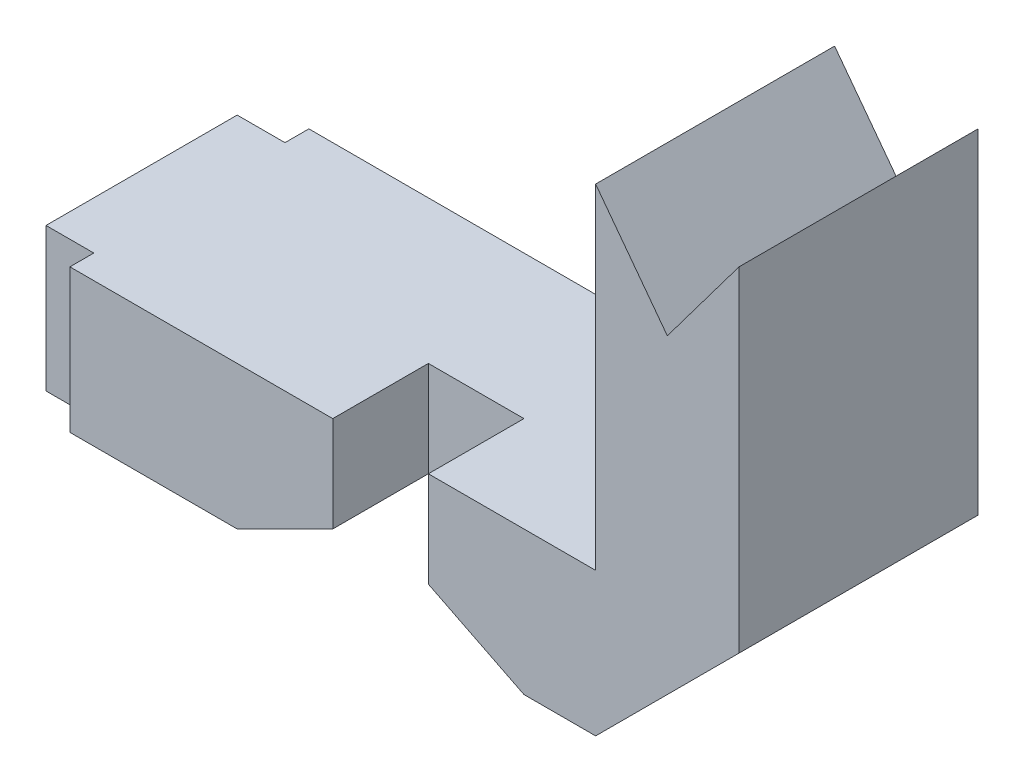
ISO-10303-21;
HEADER;
FILE_DESCRIPTION(('STEP AP214'),'2;1');
FILE_NAME('part.step','',(''),(''),'','','');
FILE_SCHEMA(('AUTOMOTIVE_DESIGN { 1 0 10303 214 1 1 1 1 }'));
ENDSEC;
DATA;
#1=APPLICATION_CONTEXT('core data for automotive mechanical design processes');
#2=APPLICATION_PROTOCOL_DEFINITION('international standard','automotive_design',2000,#1);
#3=PRODUCT_CONTEXT('',#1,'mechanical');
#4=PRODUCT('Part','Part','',(#3));
#5=PRODUCT_RELATED_PRODUCT_CATEGORY('part','',(#4));
#6=PRODUCT_DEFINITION_FORMATION('','',#4);
#7=PRODUCT_DEFINITION_CONTEXT('part definition',#1,'design');
#8=PRODUCT_DEFINITION('design','',#6,#7);
#9=PRODUCT_DEFINITION_SHAPE('','',#8);
#10=(LENGTH_UNIT() NAMED_UNIT(*) SI_UNIT(.MILLI.,.METRE.));
#11=(NAMED_UNIT(*) PLANE_ANGLE_UNIT() SI_UNIT($,.RADIAN.));
#12=(NAMED_UNIT(*) SI_UNIT($,.STERADIAN.) SOLID_ANGLE_UNIT());
#13=UNCERTAINTY_MEASURE_WITH_UNIT(LENGTH_MEASURE(1.E-05),#10,'distance_accuracy_value','');
#14=(GEOMETRIC_REPRESENTATION_CONTEXT(3) GLOBAL_UNCERTAINTY_ASSIGNED_CONTEXT((#13)) GLOBAL_UNIT_ASSIGNED_CONTEXT((#10,
#11,#12)) REPRESENTATION_CONTEXT('',''));
#15=CARTESIAN_POINT('',(0.,0.,0.));
#16=DIRECTION('',(0.,0.,1.));
#17=DIRECTION('',(1.,0.,0.));
#18=AXIS2_PLACEMENT_3D('',#15,#16,#17);
#19=CARTESIAN_POINT('',(0.,0.,50.));
#20=DIRECTION('',(0.,0.,-1.));
#21=DIRECTION('',(-1.,0.,0.));
#22=AXIS2_PLACEMENT_3D('',#19,#20,#21);
#23=PLANE('',#22);
#24=DIRECTION('',(1.,0.,0.));
#25=VECTOR('',#24,1.);
#26=CARTESIAN_POINT('',(-150.,0.,50.));
#27=LINE('',#26,#25);
#28=CARTESIAN_POINT('',(-140.,0.,50.));
#29=VERTEX_POINT('',#28);
#30=CARTESIAN_POINT('',(-85.,0.,50.));
#31=VERTEX_POINT('',#30);
#32=EDGE_CURVE('E181',#29,#31,#27,.T.);
#33=ORIENTED_EDGE('',*,*,#32,.F.);
#34=DIRECTION('',(0.,1.,0.));
#35=VECTOR('',#34,1.);
#36=CARTESIAN_POINT('',(-140.,-30.,50.));
#37=LINE('',#36,#35);
#38=CARTESIAN_POINT('',(-140.,-30.,50.));
#39=VERTEX_POINT('',#38);
#40=EDGE_CURVE('E166',#39,#29,#37,.T.);
#41=ORIENTED_EDGE('',*,*,#40,.F.);
#42=DIRECTION('',(1.,0.,0.));
#43=VECTOR('',#42,1.);
#44=CARTESIAN_POINT('',(-150.,-30.,50.));
#45=LINE('',#44,#43);
#46=CARTESIAN_POINT('',(-105.,-30.,50.));
#47=VERTEX_POINT('',#46);
#48=EDGE_CURVE('E178',#39,#47,#45,.T.);
#49=ORIENTED_EDGE('',*,*,#48,.T.);
#50=DIRECTION('',(-0.894427190999916,-0.447213595499958,0.));
#51=VECTOR('',#50,1.);
#52=CARTESIAN_POINT('',(-105.,-30.,50.));
#53=LINE('',#52,#51);
#54=CARTESIAN_POINT('',(-85.,-20.,50.));
#55=VERTEX_POINT('',#54);
#56=EDGE_CURVE('E271',#55,#47,#53,.T.);
#57=ORIENTED_EDGE('',*,*,#56,.F.);
#58=DIRECTION('',(0.,-1.,0.));
#59=VECTOR('',#58,1.);
#60=CARTESIAN_POINT('',(-85.,0.,50.));
#61=LINE('',#60,#59);
#62=EDGE_CURVE('E298',#31,#55,#61,.T.);
#63=ORIENTED_EDGE('',*,*,#62,.F.);
#64=EDGE_LOOP('',(#33,#41,#49,#57,#63));
#65=FACE_BOUND('',#64,.T.);
#66=ADVANCED_FACE('F33',(#65),#23,.F.);
#67=CARTESIAN_POINT('',(-150.,-30.,50.));
#68=DIRECTION('',(0.,1.,0.));
#69=DIRECTION('',(-1.,0.,0.));
#70=AXIS2_PLACEMENT_3D('',#67,#68,#69);
#71=PLANE('',#70);
#72=DIRECTION('',(0.,0.,-1.));
#73=VECTOR('',#72,1.);
#74=CARTESIAN_POINT('',(-140.,-30.,50.));
#75=LINE('',#74,#73);
#76=CARTESIAN_POINT('',(-140.,-30.,45.));
#77=VERTEX_POINT('',#76);
#78=EDGE_CURVE('E162',#39,#77,#75,.T.);
#79=ORIENTED_EDGE('',*,*,#78,.T.);
#80=DIRECTION('',(-1.,0.,0.));
#81=VECTOR('',#80,1.);
#82=CARTESIAN_POINT('',(-150.,-30.,45.));
#83=LINE('',#82,#81);
#84=CARTESIAN_POINT('',(-150.,-30.,45.));
#85=VERTEX_POINT('',#84);
#86=EDGE_CURVE('E173',#77,#85,#83,.T.);
#87=ORIENTED_EDGE('',*,*,#86,.T.);
#88=DIRECTION('',(0.,0.,-1.));
#89=VECTOR('',#88,1.);
#90=CARTESIAN_POINT('',(-150.,-30.,50.));
#91=LINE('',#90,#89);
#92=CARTESIAN_POINT('',(-150.,-30.,5.));
#93=VERTEX_POINT('',#92);
#94=EDGE_CURVE('E232',#85,#93,#91,.T.);
#95=ORIENTED_EDGE('',*,*,#94,.T.);
#96=DIRECTION('',(1.,0.,0.));
#97=VECTOR('',#96,1.);
#98=CARTESIAN_POINT('',(-150.,-30.,5.));
#99=LINE('',#98,#97);
#100=CARTESIAN_POINT('',(-140.,-30.,5.));
#101=VERTEX_POINT('',#100);
#102=EDGE_CURVE('E317',#93,#101,#99,.T.);
#103=ORIENTED_EDGE('',*,*,#102,.T.);
#104=DIRECTION('',(0.,0.,-1.));
#105=VECTOR('',#104,1.);
#106=CARTESIAN_POINT('',(-140.,-30.,0.));
#107=LINE('',#106,#105);
#108=CARTESIAN_POINT('',(-140.,-30.,0.));
#109=VERTEX_POINT('',#108);
#110=EDGE_CURVE('E311',#101,#109,#107,.T.);
#111=ORIENTED_EDGE('',*,*,#110,.T.);
#112=DIRECTION('',(1.,0.,0.));
#113=VECTOR('',#112,1.);
#114=CARTESIAN_POINT('',(-150.,-30.,0.));
#115=LINE('',#114,#113);
#116=CARTESIAN_POINT('',(-105.,-30.,0.));
#117=VERTEX_POINT('',#116);
#118=EDGE_CURVE('E212',#109,#117,#115,.T.);
#119=ORIENTED_EDGE('',*,*,#118,.T.);
#120=DIRECTION('',(0.,0.,1.));
#121=VECTOR('',#120,1.);
#122=CARTESIAN_POINT('',(-105.,-30.,0.));
#123=LINE('',#122,#121);
#124=EDGE_CURVE('E186',#117,#47,#123,.T.);
#125=ORIENTED_EDGE('',*,*,#124,.T.);
#126=ORIENTED_EDGE('',*,*,#48,.F.);
#127=EDGE_LOOP('',(#79,#87,#95,#103,#111,#119,#125,#126));
#128=FACE_BOUND('',#127,.T.);
#129=ADVANCED_FACE('F184',(#128),#71,.F.);
#130=CARTESIAN_POINT('',(-15.,50.,50.));
#131=DIRECTION('',(-0.8,0.6,0.));
#132=DIRECTION('',(-0.6,-0.8,0.));
#133=AXIS2_PLACEMENT_3D('',#130,#131,#132);
#134=PLANE('',#133);
#135=DIRECTION('',(0.6,0.8,0.));
#136=VECTOR('',#135,1.);
#137=CARTESIAN_POINT('',(-15.,50.,0.));
#138=LINE('',#137,#136);
#139=CARTESIAN_POINT('',(-15.,50.,0.));
#140=VERTEX_POINT('',#139);
#141=CARTESIAN_POINT('',(0.,70.,0.));
#142=VERTEX_POINT('',#141);
#143=EDGE_CURVE('E202',#140,#142,#138,.T.);
#144=ORIENTED_EDGE('',*,*,#143,.F.);
#145=DIRECTION('',(0.,0.,-1.));
#146=VECTOR('',#145,1.);
#147=CARTESIAN_POINT('',(-15.,50.,50.));
#148=LINE('',#147,#146);
#149=CARTESIAN_POINT('',(-15.,50.,50.));
#150=VERTEX_POINT('',#149);
#151=EDGE_CURVE('E41',#150,#140,#148,.T.);
#152=ORIENTED_EDGE('',*,*,#151,.F.);
#153=DIRECTION('',(0.6,0.8,0.));
#154=VECTOR('',#153,1.);
#155=CARTESIAN_POINT('',(-15.,50.,50.));
#156=LINE('',#155,#154);
#157=CARTESIAN_POINT('',(0.,70.,50.));
#158=VERTEX_POINT('',#157);
#159=EDGE_CURVE('E222',#150,#158,#156,.T.);
#160=ORIENTED_EDGE('',*,*,#159,.T.);
#161=DIRECTION('',(0.,0.,-1.));
#162=VECTOR('',#161,1.);
#163=CARTESIAN_POINT('',(0.,70.,50.));
#164=LINE('',#163,#162);
#165=EDGE_CURVE('E201',#158,#142,#164,.T.);
#166=ORIENTED_EDGE('',*,*,#165,.T.);
#167=EDGE_LOOP('',(#144,#152,#160,#166));
#168=FACE_BOUND('',#167,.T.);
#169=ADVANCED_FACE('F35',(#168),#134,.T.);
#170=CARTESIAN_POINT('',(-30.,70.,50.));
#171=DIRECTION('',(0.8,0.599999999999999,0.));
#172=DIRECTION('',(-0.6,0.800000000000001,0.));
#173=AXIS2_PLACEMENT_3D('',#170,#171,#172);
#174=PLANE('',#173);
#175=DIRECTION('',(0.6,-0.8,0.));
#176=VECTOR('',#175,1.);
#177=CARTESIAN_POINT('',(-30.,70.,0.));
#178=LINE('',#177,#176);
#179=CARTESIAN_POINT('',(-30.,70.,0.));
#180=VERTEX_POINT('',#179);
#181=EDGE_CURVE('E219',#180,#140,#178,.T.);
#182=ORIENTED_EDGE('',*,*,#181,.F.);
#183=DIRECTION('',(0.,0.,-1.));
#184=VECTOR('',#183,1.);
#185=CARTESIAN_POINT('',(-30.,70.,50.));
#186=LINE('',#185,#184);
#187=CARTESIAN_POINT('',(-30.,70.,50.));
#188=VERTEX_POINT('',#187);
#189=EDGE_CURVE('E224',#188,#180,#186,.T.);
#190=ORIENTED_EDGE('',*,*,#189,.F.);
#191=DIRECTION('',(0.6,-0.8,0.));
#192=VECTOR('',#191,1.);
#193=CARTESIAN_POINT('',(-30.,70.,50.));
#194=LINE('',#193,#192);
#195=EDGE_CURVE('E198',#188,#150,#194,.T.);
#196=ORIENTED_EDGE('',*,*,#195,.T.);
#197=ORIENTED_EDGE('',*,*,#151,.T.);
#198=EDGE_LOOP('',(#182,#190,#196,#197));
#199=FACE_BOUND('',#198,.T.);
#200=ADVANCED_FACE('F254',(#199),#174,.T.);
#201=CARTESIAN_POINT('',(-30.,0.,50.));
#202=DIRECTION('',(-1.,0.,0.));
#203=DIRECTION('',(0.,-1.,0.));
#204=AXIS2_PLACEMENT_3D('',#201,#202,#203);
#205=PLANE('',#204);
#206=DIRECTION('',(0.,1.,0.));
#207=VECTOR('',#206,1.);
#208=CARTESIAN_POINT('',(-30.,0.,0.));
#209=LINE('',#208,#207);
#210=CARTESIAN_POINT('',(-30.,0.,0.));
#211=VERTEX_POINT('',#210);
#212=EDGE_CURVE('E216',#211,#180,#209,.T.);
#213=ORIENTED_EDGE('',*,*,#212,.F.);
#214=DIRECTION('',(0.,0.,-1.));
#215=VECTOR('',#214,1.);
#216=CARTESIAN_POINT('',(-30.,0.,50.));
#217=LINE('',#216,#215);
#218=CARTESIAN_POINT('',(-30.,0.,50.));
#219=VERTEX_POINT('',#218);
#220=EDGE_CURVE('E226',#219,#211,#217,.T.);
#221=ORIENTED_EDGE('',*,*,#220,.F.);
#222=DIRECTION('',(0.,1.,0.));
#223=VECTOR('',#222,1.);
#224=CARTESIAN_POINT('',(-30.,0.,50.));
#225=LINE('',#224,#223);
#226=EDGE_CURVE('E195',#219,#188,#225,.T.);
#227=ORIENTED_EDGE('',*,*,#226,.T.);
#228=ORIENTED_EDGE('',*,*,#189,.T.);
#229=EDGE_LOOP('',(#213,#221,#227,#228));
#230=FACE_BOUND('',#229,.T.);
#231=ADVANCED_FACE('F404',(#230),#205,.T.);
#232=CARTESIAN_POINT('',(-150.,0.,50.));
#233=DIRECTION('',(0.,1.,0.));
#234=DIRECTION('',(-1.,0.,0.));
#235=AXIS2_PLACEMENT_3D('',#232,#233,#234);
#236=PLANE('',#235);
#237=DIRECTION('',(-1.,0.,0.));
#238=VECTOR('',#237,1.);
#239=CARTESIAN_POINT('',(-150.,0.,45.));
#240=LINE('',#239,#238);
#241=CARTESIAN_POINT('',(-140.,0.,45.));
#242=VERTEX_POINT('',#241);
#243=CARTESIAN_POINT('',(-150.,0.,45.));
#244=VERTEX_POINT('',#243);
#245=EDGE_CURVE('E48',#242,#244,#240,.T.);
#246=ORIENTED_EDGE('',*,*,#245,.F.);
#247=DIRECTION('',(0.,0.,-1.));
#248=VECTOR('',#247,1.);
#249=CARTESIAN_POINT('',(-140.,0.,50.));
#250=LINE('',#249,#248);
#251=EDGE_CURVE('E315',#29,#242,#250,.T.);
#252=ORIENTED_EDGE('',*,*,#251,.F.);
#253=ORIENTED_EDGE('',*,*,#32,.T.);
#254=DIRECTION('',(0.,0.,1.));
#255=VECTOR('',#254,1.);
#256=CARTESIAN_POINT('',(-85.,0.,30.));
#257=LINE('',#256,#255);
#258=CARTESIAN_POINT('',(-85.,0.,30.));
#259=VERTEX_POINT('',#258);
#260=EDGE_CURVE('E283',#259,#31,#257,.T.);
#261=ORIENTED_EDGE('',*,*,#260,.F.);
#262=DIRECTION('',(-1.,0.,0.));
#263=VECTOR('',#262,1.);
#264=CARTESIAN_POINT('',(-85.,0.,30.));
#265=LINE('',#264,#263);
#266=CARTESIAN_POINT('',(-65.,0.,30.));
#267=VERTEX_POINT('',#266);
#268=EDGE_CURVE('E288',#267,#259,#265,.T.);
#269=ORIENTED_EDGE('',*,*,#268,.F.);
#270=DIRECTION('',(0.,0.,1.));
#271=VECTOR('',#270,1.);
#272=CARTESIAN_POINT('',(-65.,0.,30.));
#273=LINE('',#272,#271);
#274=CARTESIAN_POINT('',(-65.,0.,50.));
#275=VERTEX_POINT('',#274);
#276=EDGE_CURVE('E290',#267,#275,#273,.T.);
#277=ORIENTED_EDGE('',*,*,#276,.T.);
#278=EDGE_CURVE('E187',#275,#219,#27,.T.);
#279=ORIENTED_EDGE('',*,*,#278,.T.);
#280=ORIENTED_EDGE('',*,*,#220,.T.);
#281=DIRECTION('',(1.,0.,0.));
#282=VECTOR('',#281,1.);
#283=CARTESIAN_POINT('',(-150.,0.,0.));
#284=LINE('',#283,#282);
#285=CARTESIAN_POINT('',(-140.,0.,0.));
#286=VERTEX_POINT('',#285);
#287=EDGE_CURVE('E214',#286,#211,#284,.T.);
#288=ORIENTED_EDGE('',*,*,#287,.F.);
#289=DIRECTION('',(0.,0.,-1.));
#290=VECTOR('',#289,1.);
#291=CARTESIAN_POINT('',(-140.,0.,0.));
#292=LINE('',#291,#290);
#293=CARTESIAN_POINT('',(-140.,0.,5.));
#294=VERTEX_POINT('',#293);
#295=EDGE_CURVE('E56',#294,#286,#292,.T.);
#296=ORIENTED_EDGE('',*,*,#295,.F.);
#297=DIRECTION('',(1.,0.,0.));
#298=VECTOR('',#297,1.);
#299=CARTESIAN_POINT('',(-150.,0.,5.));
#300=LINE('',#299,#298);
#301=CARTESIAN_POINT('',(-150.,0.,5.));
#302=VERTEX_POINT('',#301);
#303=EDGE_CURVE('E318',#302,#294,#300,.T.);
#304=ORIENTED_EDGE('',*,*,#303,.F.);
#305=DIRECTION('',(0.,0.,-1.));
#306=VECTOR('',#305,1.);
#307=CARTESIAN_POINT('',(-150.,0.,50.));
#308=LINE('',#307,#306);
#309=EDGE_CURVE('E229',#244,#302,#308,.T.);
#310=ORIENTED_EDGE('',*,*,#309,.F.);
#311=EDGE_LOOP('',(#246,#252,#253,#261,#269,#277,#279,#280,#288,#296,#304,#310));
#312=FACE_BOUND('',#311,.T.);
#313=ADVANCED_FACE('F338',(#312),#236,.T.);
#314=CARTESIAN_POINT('',(-150.,0.,50.));
#315=DIRECTION('',(1.,0.,0.));
#316=DIRECTION('',(0.,0.,-1.));
#317=AXIS2_PLACEMENT_3D('',#314,#315,#316);
#318=PLANE('',#317);
#319=ORIENTED_EDGE('',*,*,#94,.F.);
#320=DIRECTION('',(0.,1.,0.));
#321=VECTOR('',#320,1.);
#322=CARTESIAN_POINT('',(-150.,-30.,45.));
#323=LINE('',#322,#321);
#324=EDGE_CURVE('E300',#85,#244,#323,.T.);
#325=ORIENTED_EDGE('',*,*,#324,.T.);
#326=ORIENTED_EDGE('',*,*,#309,.T.);
#327=DIRECTION('',(0.,1.,0.));
#328=VECTOR('',#327,1.);
#329=CARTESIAN_POINT('',(-150.,-30.,5.));
#330=LINE('',#329,#328);
#331=EDGE_CURVE('E308',#93,#302,#330,.T.);
#332=ORIENTED_EDGE('',*,*,#331,.F.);
#333=EDGE_LOOP('',(#319,#325,#326,#332));
#334=FACE_BOUND('',#333,.T.);
#335=ADVANCED_FACE('F332',(#334),#318,.F.);
#336=CARTESIAN_POINT('',(-45.,-30.,50.));
#337=VERTEX_POINT('',#336);
#338=CARTESIAN_POINT('',(-30.,-30.,50.));
#339=VERTEX_POINT('',#338);
#340=EDGE_CURVE('E188',#337,#339,#45,.T.);
#341=ORIENTED_EDGE('',*,*,#340,.F.);
#342=DIRECTION('',(0.,0.,1.));
#343=VECTOR('',#342,1.);
#344=CARTESIAN_POINT('',(-45.,-30.,0.));
#345=LINE('',#344,#343);
#346=CARTESIAN_POINT('',(-45.,-30.,0.));
#347=VERTEX_POINT('',#346);
#348=EDGE_CURVE('E264',#347,#337,#345,.T.);
#349=ORIENTED_EDGE('',*,*,#348,.F.);
#350=CARTESIAN_POINT('',(-30.,-30.,0.));
#351=VERTEX_POINT('',#350);
#352=EDGE_CURVE('E211',#347,#351,#115,.T.);
#353=ORIENTED_EDGE('',*,*,#352,.T.);
#354=DIRECTION('',(0.,0.,-1.));
#355=VECTOR('',#354,1.);
#356=CARTESIAN_POINT('',(-30.,-30.,50.));
#357=LINE('',#356,#355);
#358=EDGE_CURVE('E235',#339,#351,#357,.T.);
#359=ORIENTED_EDGE('',*,*,#358,.F.);
#360=EDGE_LOOP('',(#341,#349,#353,#359));
#361=FACE_BOUND('',#360,.T.);
#362=ADVANCED_FACE('F356',(#361),#71,.F.);
#363=CARTESIAN_POINT('',(0.,0.,50.));
#364=DIRECTION('',(0.707106781186547,-0.707106781186547,0.));
#365=DIRECTION('',(0.707106781186548,0.707106781186548,0.));
#366=AXIS2_PLACEMENT_3D('',#363,#364,#365);
#367=PLANE('',#366);
#368=DIRECTION('',(-0.707106781186547,-0.707106781186547,0.));
#369=VECTOR('',#368,1.);
#370=CARTESIAN_POINT('',(0.,0.,0.));
#371=LINE('',#370,#369);
#372=CARTESIAN_POINT('',(0.,0.,0.));
#373=VERTEX_POINT('',#372);
#374=EDGE_CURVE('E208',#373,#351,#371,.T.);
#375=ORIENTED_EDGE('',*,*,#374,.F.);
#376=DIRECTION('',(0.,0.,-1.));
#377=VECTOR('',#376,1.);
#378=CARTESIAN_POINT('',(0.,0.,50.));
#379=LINE('',#378,#377);
#380=CARTESIAN_POINT('',(0.,0.,50.));
#381=VERTEX_POINT('',#380);
#382=EDGE_CURVE('E238',#381,#373,#379,.T.);
#383=ORIENTED_EDGE('',*,*,#382,.F.);
#384=DIRECTION('',(-0.707106781186547,-0.707106781186547,0.));
#385=VECTOR('',#384,1.);
#386=CARTESIAN_POINT('',(0.,0.,50.));
#387=LINE('',#386,#385);
#388=EDGE_CURVE('E191',#381,#339,#387,.T.);
#389=ORIENTED_EDGE('',*,*,#388,.T.);
#390=ORIENTED_EDGE('',*,*,#358,.T.);
#391=EDGE_LOOP('',(#375,#383,#389,#390));
#392=FACE_BOUND('',#391,.T.);
#393=ADVANCED_FACE('F392',(#392),#367,.T.);
#394=CARTESIAN_POINT('',(0.,70.,50.));
#395=DIRECTION('',(1.,0.,0.));
#396=DIRECTION('',(0.,1.,0.));
#397=AXIS2_PLACEMENT_3D('',#394,#395,#396);
#398=PLANE('',#397);
#399=DIRECTION('',(0.,-1.,0.));
#400=VECTOR('',#399,1.);
#401=CARTESIAN_POINT('',(0.,70.,0.));
#402=LINE('',#401,#400);
#403=EDGE_CURVE('E205',#142,#373,#402,.T.);
#404=ORIENTED_EDGE('',*,*,#403,.F.);
#405=ORIENTED_EDGE('',*,*,#165,.F.);
#406=DIRECTION('',(0.,-1.,0.));
#407=VECTOR('',#406,1.);
#408=CARTESIAN_POINT('',(0.,70.,50.));
#409=LINE('',#408,#407);
#410=EDGE_CURVE('E261',#158,#381,#409,.T.);
#411=ORIENTED_EDGE('',*,*,#410,.T.);
#412=ORIENTED_EDGE('',*,*,#382,.T.);
#413=EDGE_LOOP('',(#404,#405,#411,#412));
#414=FACE_BOUND('',#413,.T.);
#415=ADVANCED_FACE('F247',(#414),#398,.T.);
#416=ORIENTED_EDGE('',*,*,#278,.F.);
#417=DIRECTION('',(0.,1.,0.));
#418=VECTOR('',#417,1.);
#419=CARTESIAN_POINT('',(-65.,0.,50.));
#420=LINE('',#419,#418);
#421=CARTESIAN_POINT('',(-65.,-20.,50.));
#422=VERTEX_POINT('',#421);
#423=EDGE_CURVE('E295',#422,#275,#420,.T.);
#424=ORIENTED_EDGE('',*,*,#423,.F.);
#425=DIRECTION('',(-0.894427190999916,0.447213595499958,0.));
#426=VECTOR('',#425,1.);
#427=CARTESIAN_POINT('',(-75.,-15.,50.));
#428=LINE('',#427,#426);
#429=EDGE_CURVE('E274',#337,#422,#428,.T.);
#430=ORIENTED_EDGE('',*,*,#429,.F.);
#431=ORIENTED_EDGE('',*,*,#340,.T.);
#432=ORIENTED_EDGE('',*,*,#388,.F.);
#433=ORIENTED_EDGE('',*,*,#410,.F.);
#434=ORIENTED_EDGE('',*,*,#159,.F.);
#435=ORIENTED_EDGE('',*,*,#195,.F.);
#436=ORIENTED_EDGE('',*,*,#226,.F.);
#437=EDGE_LOOP('',(#416,#424,#430,#431,#432,#433,#434,#435,#436));
#438=FACE_BOUND('',#437,.T.);
#439=ADVANCED_FACE('F258',(#438),#23,.F.);
#440=CARTESIAN_POINT('',(0.,0.,0.));
#441=DIRECTION('',(0.,0.,-1.));
#442=DIRECTION('',(-1.,0.,0.));
#443=AXIS2_PLACEMENT_3D('',#440,#441,#442);
#444=PLANE('',#443);
#445=DIRECTION('',(0.,1.,0.));
#446=VECTOR('',#445,1.);
#447=CARTESIAN_POINT('',(-140.,-30.,0.));
#448=LINE('',#447,#446);
#449=EDGE_CURVE('E313',#109,#286,#448,.T.);
#450=ORIENTED_EDGE('',*,*,#449,.T.);
#451=ORIENTED_EDGE('',*,*,#287,.T.);
#452=ORIENTED_EDGE('',*,*,#212,.T.);
#453=ORIENTED_EDGE('',*,*,#181,.T.);
#454=ORIENTED_EDGE('',*,*,#143,.T.);
#455=ORIENTED_EDGE('',*,*,#403,.T.);
#456=ORIENTED_EDGE('',*,*,#374,.T.);
#457=ORIENTED_EDGE('',*,*,#352,.F.);
#458=DIRECTION('',(-0.894427190999916,0.447213595499958,0.));
#459=VECTOR('',#458,1.);
#460=CARTESIAN_POINT('',(-75.,-15.,0.));
#461=LINE('',#460,#459);
#462=CARTESIAN_POINT('',(-75.,-15.,0.));
#463=VERTEX_POINT('',#462);
#464=EDGE_CURVE('E273',#347,#463,#461,.T.);
#465=ORIENTED_EDGE('',*,*,#464,.T.);
#466=DIRECTION('',(-0.894427190999916,-0.447213595499958,0.));
#467=VECTOR('',#466,1.);
#468=CARTESIAN_POINT('',(-105.,-30.,0.));
#469=LINE('',#468,#467);
#470=EDGE_CURVE('E267',#463,#117,#469,.T.);
#471=ORIENTED_EDGE('',*,*,#470,.T.);
#472=ORIENTED_EDGE('',*,*,#118,.F.);
#473=EDGE_LOOP('',(#450,#451,#452,#453,#454,#455,#456,#457,#465,#471,#472));
#474=FACE_BOUND('',#473,.T.);
#475=ADVANCED_FACE('F250',(#474),#444,.T.);
#476=CARTESIAN_POINT('',(-105.,-30.,0.));
#477=DIRECTION('',(-0.447213595499958,0.894427190999916,0.));
#478=DIRECTION('',(-0.894427190999916,-0.447213595499958,0.));
#479=AXIS2_PLACEMENT_3D('',#476,#477,#478);
#480=PLANE('',#479);
#481=DIRECTION('',(0.894427190999916,0.447213595499958,0.));
#482=VECTOR('',#481,1.);
#483=CARTESIAN_POINT('',(-105.,-30.,30.));
#484=LINE('',#483,#482);
#485=CARTESIAN_POINT('',(-85.,-20.,30.));
#486=VERTEX_POINT('',#485);
#487=CARTESIAN_POINT('',(-75.,-15.,30.));
#488=VERTEX_POINT('',#487);
#489=EDGE_CURVE('E277',#486,#488,#484,.T.);
#490=ORIENTED_EDGE('',*,*,#489,.F.);
#491=DIRECTION('',(0.,0.,1.));
#492=VECTOR('',#491,1.);
#493=CARTESIAN_POINT('',(-85.,-20.,30.));
#494=LINE('',#493,#492);
#495=EDGE_CURVE('E284',#486,#55,#494,.T.);
#496=ORIENTED_EDGE('',*,*,#495,.T.);
#497=ORIENTED_EDGE('',*,*,#56,.T.);
#498=ORIENTED_EDGE('',*,*,#124,.F.);
#499=ORIENTED_EDGE('',*,*,#470,.F.);
#500=DIRECTION('',(0.,0.,1.));
#501=VECTOR('',#500,1.);
#502=CARTESIAN_POINT('',(-75.,-15.,0.));
#503=LINE('',#502,#501);
#504=EDGE_CURVE('E266',#463,#488,#503,.T.);
#505=ORIENTED_EDGE('',*,*,#504,.T.);
#506=EDGE_LOOP('',(#490,#496,#497,#498,#499,#505));
#507=FACE_BOUND('',#506,.T.);
#508=ADVANCED_FACE('F346',(#507),#480,.F.);
#509=CARTESIAN_POINT('',(-75.,-15.,0.));
#510=DIRECTION('',(0.447213595499958,0.894427190999916,0.));
#511=DIRECTION('',(-0.894427190999916,0.447213595499958,0.));
#512=AXIS2_PLACEMENT_3D('',#509,#510,#511);
#513=PLANE('',#512);
#514=ORIENTED_EDGE('',*,*,#429,.T.);
#515=DIRECTION('',(0.,0.,1.));
#516=VECTOR('',#515,1.);
#517=CARTESIAN_POINT('',(-65.,-20.,30.));
#518=LINE('',#517,#516);
#519=CARTESIAN_POINT('',(-65.,-20.,30.));
#520=VERTEX_POINT('',#519);
#521=EDGE_CURVE('E287',#520,#422,#518,.T.);
#522=ORIENTED_EDGE('',*,*,#521,.F.);
#523=DIRECTION('',(0.894427190999916,-0.447213595499958,0.));
#524=VECTOR('',#523,1.);
#525=CARTESIAN_POINT('',(-75.,-15.,30.));
#526=LINE('',#525,#524);
#527=EDGE_CURVE('E11',#488,#520,#526,.T.);
#528=ORIENTED_EDGE('',*,*,#527,.F.);
#529=ORIENTED_EDGE('',*,*,#504,.F.);
#530=ORIENTED_EDGE('',*,*,#464,.F.);
#531=ORIENTED_EDGE('',*,*,#348,.T.);
#532=EDGE_LOOP('',(#514,#522,#528,#529,#530,#531));
#533=FACE_BOUND('',#532,.T.);
#534=ADVANCED_FACE('F351',(#533),#513,.F.);
#535=CARTESIAN_POINT('',(0.,0.,30.));
#536=DIRECTION('',(0.,0.,1.));
#537=DIRECTION('',(1.,0.,0.));
#538=AXIS2_PLACEMENT_3D('',#535,#536,#537);
#539=PLANE('',#538);
#540=ORIENTED_EDGE('',*,*,#489,.T.);
#541=ORIENTED_EDGE('',*,*,#527,.T.);
#542=DIRECTION('',(0.,1.,0.));
#543=VECTOR('',#542,1.);
#544=CARTESIAN_POINT('',(-65.,0.,30.));
#545=LINE('',#544,#543);
#546=EDGE_CURVE('E303',#520,#267,#545,.T.);
#547=ORIENTED_EDGE('',*,*,#546,.T.);
#548=ORIENTED_EDGE('',*,*,#268,.T.);
#549=DIRECTION('',(0.,-1.,0.));
#550=VECTOR('',#549,1.);
#551=CARTESIAN_POINT('',(-85.,0.,30.));
#552=LINE('',#551,#550);
#553=EDGE_CURVE('E297',#259,#486,#552,.T.);
#554=ORIENTED_EDGE('',*,*,#553,.T.);
#555=EDGE_LOOP('',(#540,#541,#547,#548,#554));
#556=FACE_BOUND('',#555,.T.);
#557=ADVANCED_FACE('F366',(#556),#539,.T.);
#558=CARTESIAN_POINT('',(-85.,0.,30.));
#559=DIRECTION('',(-1.,0.,0.));
#560=DIRECTION('',(0.,0.,1.));
#561=AXIS2_PLACEMENT_3D('',#558,#559,#560);
#562=PLANE('',#561);
#563=ORIENTED_EDGE('',*,*,#62,.T.);
#564=ORIENTED_EDGE('',*,*,#495,.F.);
#565=ORIENTED_EDGE('',*,*,#553,.F.);
#566=ORIENTED_EDGE('',*,*,#260,.T.);
#567=EDGE_LOOP('',(#563,#564,#565,#566));
#568=FACE_BOUND('',#567,.T.);
#569=ADVANCED_FACE('F369',(#568),#562,.F.);
#570=CARTESIAN_POINT('',(-65.,0.,30.));
#571=DIRECTION('',(1.,0.,0.));
#572=DIRECTION('',(0.,0.,-1.));
#573=AXIS2_PLACEMENT_3D('',#570,#571,#572);
#574=PLANE('',#573);
#575=ORIENTED_EDGE('',*,*,#423,.T.);
#576=ORIENTED_EDGE('',*,*,#276,.F.);
#577=ORIENTED_EDGE('',*,*,#546,.F.);
#578=ORIENTED_EDGE('',*,*,#521,.T.);
#579=EDGE_LOOP('',(#575,#576,#577,#578));
#580=FACE_BOUND('',#579,.T.);
#581=ADVANCED_FACE('F363',(#580),#574,.F.);
#582=CARTESIAN_POINT('',(-140.,-30.,0.));
#583=DIRECTION('',(1.,0.,0.));
#584=DIRECTION('',(0.,1.,0.));
#585=AXIS2_PLACEMENT_3D('',#582,#583,#584);
#586=PLANE('',#585);
#587=ORIENTED_EDGE('',*,*,#295,.T.);
#588=ORIENTED_EDGE('',*,*,#449,.F.);
#589=ORIENTED_EDGE('',*,*,#110,.F.);
#590=DIRECTION('',(0.,1.,0.));
#591=VECTOR('',#590,1.);
#592=CARTESIAN_POINT('',(-140.,-30.,5.));
#593=LINE('',#592,#591);
#594=EDGE_CURVE('E310',#101,#294,#593,.T.);
#595=ORIENTED_EDGE('',*,*,#594,.T.);
#596=EDGE_LOOP('',(#587,#588,#589,#595));
#597=FACE_BOUND('',#596,.T.);
#598=ADVANCED_FACE('F343',(#597),#586,.F.);
#599=CARTESIAN_POINT('',(-150.,-30.,5.));
#600=DIRECTION('',(0.,0.,1.));
#601=DIRECTION('',(1.,0.,0.));
#602=AXIS2_PLACEMENT_3D('',#599,#600,#601);
#603=PLANE('',#602);
#604=ORIENTED_EDGE('',*,*,#303,.T.);
#605=ORIENTED_EDGE('',*,*,#594,.F.);
#606=ORIENTED_EDGE('',*,*,#102,.F.);
#607=ORIENTED_EDGE('',*,*,#331,.T.);
#608=EDGE_LOOP('',(#604,#605,#606,#607));
#609=FACE_BOUND('',#608,.T.);
#610=ADVANCED_FACE('F336',(#609),#603,.F.);
#611=CARTESIAN_POINT('',(-150.,-30.,45.));
#612=DIRECTION('',(0.,0.,-1.));
#613=DIRECTION('',(-1.,0.,0.));
#614=AXIS2_PLACEMENT_3D('',#611,#612,#613);
#615=PLANE('',#614);
#616=ORIENTED_EDGE('',*,*,#245,.T.);
#617=ORIENTED_EDGE('',*,*,#324,.F.);
#618=ORIENTED_EDGE('',*,*,#86,.F.);
#619=DIRECTION('',(0.,1.,0.));
#620=VECTOR('',#619,1.);
#621=CARTESIAN_POINT('',(-140.,-30.,45.));
#622=LINE('',#621,#620);
#623=EDGE_CURVE('E168',#77,#242,#622,.T.);
#624=ORIENTED_EDGE('',*,*,#623,.T.);
#625=EDGE_LOOP('',(#616,#617,#618,#624));
#626=FACE_BOUND('',#625,.T.);
#627=ADVANCED_FACE('F462',(#626),#615,.F.);
#628=CARTESIAN_POINT('',(-140.,-30.,50.));
#629=DIRECTION('',(1.,0.,0.));
#630=DIRECTION('',(0.,1.,0.));
#631=AXIS2_PLACEMENT_3D('',#628,#629,#630);
#632=PLANE('',#631);
#633=ORIENTED_EDGE('',*,*,#251,.T.);
#634=ORIENTED_EDGE('',*,*,#623,.F.);
#635=ORIENTED_EDGE('',*,*,#78,.F.);
#636=ORIENTED_EDGE('',*,*,#40,.T.);
#637=EDGE_LOOP('',(#633,#634,#635,#636));
#638=FACE_BOUND('',#637,.T.);
#639=ADVANCED_FACE('F165',(#638),#632,.F.);
#640=CLOSED_SHELL('',(#66,#129,#169,#200,#231,#313,#335,#362,#393,#415,#439,#475,#508,#534,#557,
#569,#581,#598,#610,#627,#639));
#641=MANIFOLD_SOLID_BREP('B2',#640);
#642=ADVANCED_BREP_SHAPE_REPRESENTATION('',(#18,#641),#14);
#643=SHAPE_DEFINITION_REPRESENTATION(#9,#642);
ENDSEC;
END-ISO-10303-21;
